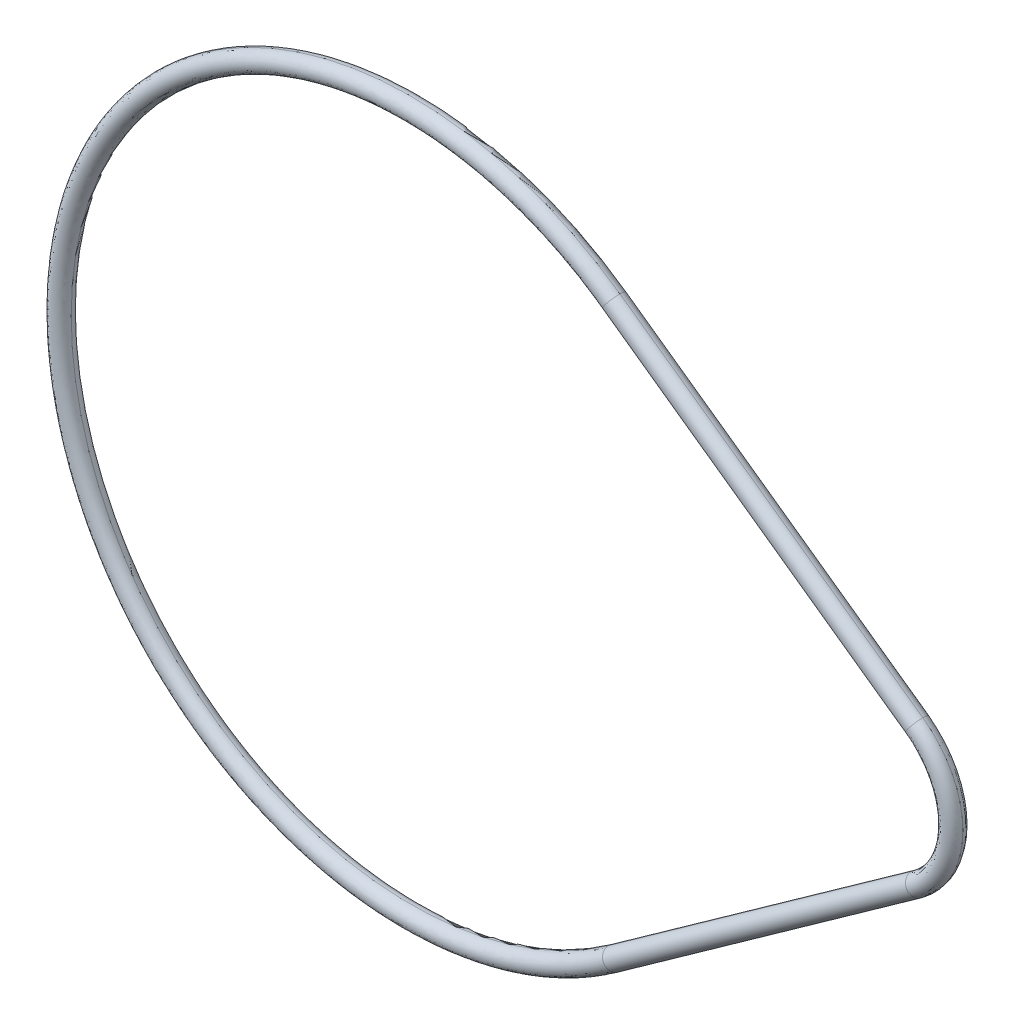
ISO-10303-21;
HEADER;
FILE_DESCRIPTION(('STEP AP214'),'2;1');
FILE_NAME('part.step','',(''),(''),'','','');
FILE_SCHEMA(('AUTOMOTIVE_DESIGN { 1 0 10303 214 1 1 1 1 }'));
ENDSEC;
DATA;
#1=APPLICATION_CONTEXT('core data for automotive mechanical design processes');
#2=APPLICATION_PROTOCOL_DEFINITION('international standard','automotive_design',2000,#1);
#3=PRODUCT_CONTEXT('',#1,'mechanical');
#4=PRODUCT('Part','Part','',(#3));
#5=PRODUCT_RELATED_PRODUCT_CATEGORY('part','',(#4));
#6=PRODUCT_DEFINITION_FORMATION('','',#4);
#7=PRODUCT_DEFINITION_CONTEXT('part definition',#1,'design');
#8=PRODUCT_DEFINITION('design','',#6,#7);
#9=PRODUCT_DEFINITION_SHAPE('','',#8);
#10=(LENGTH_UNIT() NAMED_UNIT(*) SI_UNIT(.MILLI.,.METRE.));
#11=(NAMED_UNIT(*) PLANE_ANGLE_UNIT() SI_UNIT($,.RADIAN.));
#12=(NAMED_UNIT(*) SI_UNIT($,.STERADIAN.) SOLID_ANGLE_UNIT());
#13=UNCERTAINTY_MEASURE_WITH_UNIT(LENGTH_MEASURE(1.E-05),#10,'distance_accuracy_value','');
#14=(GEOMETRIC_REPRESENTATION_CONTEXT(3) GLOBAL_UNCERTAINTY_ASSIGNED_CONTEXT((#13)) GLOBAL_UNIT_ASSIGNED_CONTEXT((#10,
#11,#12)) REPRESENTATION_CONTEXT('',''));
#15=CARTESIAN_POINT('',(0.,0.,0.));
#16=DIRECTION('',(0.,0.,1.));
#17=DIRECTION('',(1.,0.,0.));
#18=AXIS2_PLACEMENT_3D('',#15,#16,#17);
#19=CARTESIAN_POINT('',(20.8161999194433,-29.2365851450577,-0.000527050012894062));
#20=CARTESIAN_POINT('',(-5.33979762134282,-47.8594328955761,-0.000527050012904014));
#21=CARTESIAN_POINT('',(-26.7480982643424,-23.9297164477879,-0.000527050012908594));
#22=CARTESIAN_POINT('',(-48.156398907342,0.,-0.000527050012913173));
#23=CARTESIAN_POINT('',(-26.748098264342,23.9297164477884,-0.000527050012904236));
#24=CARTESIAN_POINT('',(-5.339797621342,47.8594328955762,-0.000527050012895298));
#25=CARTESIAN_POINT('',(20.816199919444,29.2365851450574,-0.000527050012888737));
#26=CARTESIAN_POINT('',(20.8162,-29.2365852582005,-0.00026352502464842));
#27=CARTESIAN_POINT('',(-5.33979764200732,-47.8594330807876,-0.000263525024658373));
#28=CARTESIAN_POINT('',(-26.748098367855,-23.9297165403936,-0.000263525024662952));
#29=CARTESIAN_POINT('',(-48.1563990937028,0.,-0.000263525024667531));
#30=CARTESIAN_POINT('',(-26.7480983678546,23.9297165403941,-0.000263525024658594));
#31=CARTESIAN_POINT('',(-5.33979764200651,47.8594330807877,-0.000263525024649656));
#32=CARTESIAN_POINT('',(20.8162000000007,29.2365852582002,-0.000263525024643095));
#33=CARTESIAN_POINT('',(20.8162,-29.2365852582005,1.98441115552759E-13));
#34=CARTESIAN_POINT('',(-5.33979764200732,-47.8594330807876,1.88488159173581E-13));
#35=CARTESIAN_POINT('',(-26.748098367855,-23.9297165403936,1.8390899366285E-13));
#36=CARTESIAN_POINT('',(-48.1563990937027,0.,1.79329828152119E-13));
#37=CARTESIAN_POINT('',(-26.7480983678546,23.9297165403941,1.8826726768798E-13));
#38=CARTESIAN_POINT('',(-5.33979764200651,47.8594330807877,1.9720470722384E-13));
#39=CARTESIAN_POINT('',(20.8162000000007,29.2365852582002,2.03765919542777E-13));
#40=CARTESIAN_POINT('',(20.8162000000002,-29.2365852582005,1.00000000000019));
#41=CARTESIAN_POINT('',(-5.33979764200732,-47.8594330807876,1.00000000000018));
#42=CARTESIAN_POINT('',(-26.748098367855,-23.9297165403936,1.00000000000017));
#43=CARTESIAN_POINT('',(-48.1563990937027,0.,1.00000000000017));
#44=CARTESIAN_POINT('',(-26.7480983678546,23.9297165403941,1.00000000000018));
#45=CARTESIAN_POINT('',(-5.33979764200651,47.8594330807878,1.00000000000018));
#46=CARTESIAN_POINT('',(20.8162000000007,29.2365852582002,1.00000000000019));
#47=CARTESIAN_POINT('',(20.2362,-28.4219687840239,1.00000000000019));
#48=CARTESIAN_POINT('',(-5.19101531706981,-46.5259297907128,1.00000000000018));
#49=CARTESIAN_POINT('',(-26.002818391041,-23.2629648953562,1.00000000000017));
#50=CARTESIAN_POINT('',(-46.8146214650122,0.,1.00000000000017));
#51=CARTESIAN_POINT('',(-26.0028183910406,23.2629648953566,1.00000000000018));
#52=CARTESIAN_POINT('',(-5.19101531706902,46.5259297907128,1.00000000000018));
#53=CARTESIAN_POINT('',(20.2362000000007,28.4219687840236,1.00000000000019));
#54=CARTESIAN_POINT('',(19.6562000000002,-27.6073523098472,1.00000000000019));
#55=CARTESIAN_POINT('',(-5.0422329921323,-45.1924265006379,1.00000000000018));
#56=CARTESIAN_POINT('',(-25.257538414227,-22.5962132503188,1.00000000000017));
#57=CARTESIAN_POINT('',(-45.4728438363218,0.,1.00000000000017));
#58=CARTESIAN_POINT('',(-25.2575384142266,22.5962132503192,1.00000000000018));
#59=CARTESIAN_POINT('',(-5.04223299213154,45.192426500638,1.00000000000018));
#60=CARTESIAN_POINT('',(19.6562000000007,27.6073523098469,1.00000000000019));
#61=CARTESIAN_POINT('',(19.6562,-27.6073523098472,1.98100819578805E-13));
#62=CARTESIAN_POINT('',(-5.0422329921323,-45.1924265006379,1.8870249994408E-13));
#63=CARTESIAN_POINT('',(-25.257538414227,-22.5962132503188,1.84378512227203E-13));
#64=CARTESIAN_POINT('',(-45.4728438363218,0.,1.80054524510327E-13));
#65=CARTESIAN_POINT('',(-25.2575384142266,22.5962132503192,1.88493917819614E-13));
#66=CARTESIAN_POINT('',(-5.04223299213154,45.192426500638,1.96933311128902E-13));
#67=CARTESIAN_POINT('',(19.6562000000007,27.6073523098469,2.03128894452634E-13));
#68=(BOUNDED_SURFACE() B_SPLINE_SURFACE(2,2,((#19,#20,#21,#22,#23,#24,#25),(#26,#27,#28,#29,#30,
#31,#32),(#33,#34,#35,#36,#37,#38,#39),(#40,#41,#42,#43,#44,#45,#46),(#47,#48,#49,#50,#51,#52,
#53),(#54,#55,#56,#57,#58,#59,#60),(#61,#62,#63,#64,#65,#66,#67)),.UNSPECIFIED.,.F.,.F.,
.F.) B_SPLINE_SURFACE_WITH_KNOTS((3,2,2,3),(3,2,2,3),(-0.000585341525006589,0.,1.5707963267949,
3.14159265358979),(-2.18952501746714,-0.729841672489042,0.729841672489059,2.18952501746716),
.UNSPECIFIED.) GEOMETRIC_REPRESENTATION_ITEM() RATIONAL_B_SPLINE_SURFACE(((0.999781793891307,
0.745117352170373,0.999781793891307,0.745117352170373,0.999781793891307,0.745117352170373,
0.999781793891307),(0.999890856274337,0.745198634180668,0.999890856274337,0.745198634180668,
0.999890856274337,0.745198634180668,0.999890856274337),(1.,0.745279976814,1.,0.745279976814,1.,
0.745279976814,1.),(0.707106781186543,0.526992525487729,0.707106781186543,0.526992525487729,
0.707106781186543,0.526992525487729,0.707106781186543),(1.,0.745279976814,1.,0.745279976814,1.,
0.745279976814,1.),(0.707106781186543,0.526992525487729,0.707106781186543,0.526992525487729,
0.707106781186543,0.526992525487729,0.707106781186543),(1.,0.745279976814,1.,0.745279976814,1.,
0.745279976814,1.))) REPRESENTATION_ITEM('') SURFACE());
#69=CARTESIAN_POINT('',(1.10996281610376E-09,9.92967860713456E-10,-3.3298462113317E-10));
#70=DIRECTION('',(-6.91837340867679E-12,-6.18959265071732E-12,-1.));
#71=DIRECTION('',(0.579999999966181,-0.814616474200731,1.02948756506753E-12));
#72=AXIS2_PLACEMENT_3D('',#69,#70,#71);
#73=CIRCLE('',#72,35.8900000014617);
#74=CARTESIAN_POINT('',(20.8162000007653,-29.2365852592919,-2.96036312421354E-10));
#75=VERTEX_POINT('',#74);
#76=CARTESIAN_POINT('',(20.8161999999804,29.2365852581906,-3.20402871304821E-10));
#77=VERTEX_POINT('',#76);
#78=EDGE_CURVE('E99',#75,#77,#73,.T.);
#79=CARTESIAN_POINT('',(20.2361999981067,-28.4219687814218,-3.19397772695076E-09));
#80=DIRECTION('',(-0.814616474162998,-0.580000000019177,2.34705305098352E-11));
#81=DIRECTION('',(0.580000000019178,-0.814616474162998,2.89794140134146E-09));
#82=AXIS2_PLACEMENT_3D('',#79,#80,#81);
#83=CIRCLE('',#82,1.000000004542);
#84=CARTESIAN_POINT('',(20.2362,-28.421968784,1.));
#85=VERTEX_POINT('',#84);
#86=EDGE_CURVE('E148',#75,#85,#83,.T.);
#87=CARTESIAN_POINT('',(20.2361999999972,-28.4219687839964,2.40562885060415E-11));
#88=DIRECTION('',(-0.814616474168717,-0.580000000011145,1.50855292402276E-13));
#89=DIRECTION('',(2.7790270085817E-12,-3.64291929963893E-12,1.));
#90=AXIS2_PLACEMENT_3D('',#87,#88,#89);
#91=CIRCLE('',#90,0.999999999976658);
#92=CARTESIAN_POINT('',(19.6562,-27.6073523098472,1.98345748938635E-13));
#93=VERTEX_POINT('',#92);
#94=EDGE_CURVE('E151',#85,#93,#91,.T.);
#95=CARTESIAN_POINT('',(-2.0122792321331E-13,-2.16840434497101E-13,1.9468514359833E-13));
#96=DIRECTION('',(0.,0.,-1.));
#97=DIRECTION('',(0.580000000000001,-0.814616474176652,0.));
#98=AXIS2_PLACEMENT_3D('',#95,#96,#97);
#99=CIRCLE('',#98,33.8900000000003);
#100=CARTESIAN_POINT('',(19.6562000000007,27.6073523098469,2.03373823812464E-13));
#101=VERTEX_POINT('',#100);
#102=EDGE_CURVE('E82',#93,#101,#99,.T.);
#103=CARTESIAN_POINT('',(20.2362000000196,28.4219687840878,7.17318553670182E-11));
#104=DIRECTION('',(0.814616474170328,-0.580000000008882,-1.89070879529851E-11));
#105=DIRECTION('',(0.580000000008882,0.814616474170328,-3.92134726704346E-10));
#106=AXIS2_PLACEMENT_3D('',#103,#104,#105);
#107=CIRCLE('',#106,0.999999999917621);
#108=EDGE_CURVE('E139',#77,#101,#107,.T.);
#109=ORIENTED_EDGE('',*,*,#78,.F.);
#110=ORIENTED_EDGE('',*,*,#86,.T.);
#111=ORIENTED_EDGE('',*,*,#94,.T.);
#112=ORIENTED_EDGE('',*,*,#102,.T.);
#113=ORIENTED_EDGE('',*,*,#108,.F.);
#114=EDGE_LOOP('',(#109,#110,#111,#112,#113));
#115=FACE_BOUND('',#114,.T.);
#116=ADVANCED_FACE('F16',(#115),#68,.T.);
#117=CARTESIAN_POINT('',(51.0100000005733,-7.73885650542854,2.96036312419443E-10));
#118=CARTESIAN_POINT('',(51.0100000005863,-7.73885650541927,-1.00000000030818));
#119=CARTESIAN_POINT('',(50.4300000002273,-6.92424003075651,-1.00000000030818));
#120=CARTESIAN_POINT('',(49.8499999998683,-6.10962355609375,-1.00000000030818));
#121=CARTESIAN_POINT('',(49.8499999998553,-6.10962355610301,2.96036312419443E-10));
#122=CARTESIAN_POINT('',(49.8499999998553,-6.10962355610301,0.000353605470908468));
#123=CARTESIAN_POINT('',(49.8500001448978,-6.10962375981677,0.000707210557353443));
#124=CARTESIAN_POINT('',(20.8162000007653,-29.2365852592919,-2.96036312421354E-10));
#125=CARTESIAN_POINT('',(20.8162000007783,-29.2365852592826,-1.00000000090026));
#126=CARTESIAN_POINT('',(20.2362000004193,-28.4219687846199,-1.00000000090026));
#127=CARTESIAN_POINT('',(19.6562000000603,-27.6073523099571,-1.00000000090026));
#128=CARTESIAN_POINT('',(19.6562000000472,-27.6073523099664,-2.96036312421354E-10));
#129=CARTESIAN_POINT('',(19.6562000000472,-27.6073523099664,0.000353604878835844));
#130=CARTESIAN_POINT('',(19.6562001450896,-27.6073525136801,0.000707209965280819));
#131=(BOUNDED_SURFACE() B_SPLINE_SURFACE(1,2,((#117,#118,#119,#120,#121,#122,#123),(#124,#125,
#126,#127,#128,#129,#130)),.UNSPECIFIED.,.F.,.F.,.F.) B_SPLINE_SURFACE_WITH_KNOTS((2,2),(3,2,2,
3),(-18.5325247764019,18.5325247762823),(-3.14159265358979,-1.5707963267949,0.,
0.000785398162922866),
.UNSPECIFIED.) GEOMETRIC_REPRESENTATION_ITEM() RATIONAL_B_SPLINE_SURFACE(((1.,0.707106781186548,
1.,0.707106781186548,1.,0.999853553390682,0.999707253227973),(1.,0.707106781186548,1.,
0.707106781186548,1.,0.999853553390682,0.999707253227973))) REPRESENTATION_ITEM('') SURFACE());
#132=DIRECTION('',(-0.814616474176641,-0.580000000000016,0.));
#133=VECTOR('',#132,1.);
#134=CARTESIAN_POINT('',(34.7531,-16.8584879330858,0.));
#135=LINE('',#134,#133);
#136=CARTESIAN_POINT('',(49.85,-6.10962355632446,0.));
#137=VERTEX_POINT('',#136);
#138=EDGE_CURVE('E153',#137,#93,#135,.T.);
#139=CARTESIAN_POINT('',(50.4299999984992,-6.9242400300952,-1.70008332498611E-09));
#140=DIRECTION('',(0.814616474581305,0.579999999431661,6.97821768377562E-10));
#141=DIRECTION('',(1.50084112060326E-09,-9.0480314367039E-10,-1.));
#142=AXIS2_PLACEMENT_3D('',#139,#140,#141);
#143=CIRCLE('',#142,0.999999998303194);
#144=CARTESIAN_POINT('',(50.43,-6.924240031,-1.));
#145=VERTEX_POINT('',#144);
#146=EDGE_CURVE('E27',#145,#137,#143,.T.);
#147=CARTESIAN_POINT('',(50.4299999987685,-6.92424002858438,1.77876904545515E-09));
#148=DIRECTION('',(0.814616474221296,0.579999999937297,-7.71087917067685E-11));
#149=DIRECTION('',(0.579999999937297,-0.814616474221296,-1.48273272826167E-09));
#150=AXIS2_PLACEMENT_3D('',#147,#148,#149);
#151=CIRCLE('',#150,1.00000000321353);
#152=CARTESIAN_POINT('',(51.0100000005733,-7.73885650542854,2.96036312419443E-10));
#153=VERTEX_POINT('',#152);
#154=EDGE_CURVE('E65',#153,#145,#151,.T.);
#155=DIRECTION('',(-0.814616474170556,-0.580000000008562,-1.59738792104268E-11));
#156=VECTOR('',#155,1.);
#157=CARTESIAN_POINT('',(35.9131000006693,-18.4877208823602,0.));
#158=LINE('',#157,#156);
#159=EDGE_CURVE('E145',#153,#75,#158,.T.);
#160=CARTESIAN_POINT('',(20.2362,-28.4219687840238,2.40038336987855E-11));
#161=DIRECTION('',(-0.814616474176638,-0.58000000000002,-1.16463130915027E-13));
#162=DIRECTION('',(-0.58000000000002,0.814616474176637,-2.38054879498471E-11));
#163=AXIS2_PLACEMENT_3D('',#160,#161,#162);
#164=CIRCLE('',#163,0.999999999999996);
#165=EDGE_CURVE('E129',#93,#75,#164,.T.);
#166=ORIENTED_EDGE('',*,*,#138,.F.);
#167=ORIENTED_EDGE('',*,*,#146,.F.);
#168=ORIENTED_EDGE('',*,*,#154,.F.);
#169=ORIENTED_EDGE('',*,*,#159,.T.);
#170=ORIENTED_EDGE('',*,*,#165,.F.);
#171=EDGE_LOOP('',(#166,#167,#168,#169,#170));
#172=FACE_BOUND('',#171,.T.);
#173=ADVANCED_FACE('F241',(#172),#131,.T.);
#174=CARTESIAN_POINT('',(51.0099998854202,7.73885634374881,-0.000628572010337216));
#175=CARTESIAN_POINT('',(54.999999802448,4.89801034414475,-0.000628572010337029));
#176=CARTESIAN_POINT('',(54.999999802448,0.,-0.000628572010337148));
#177=CARTESIAN_POINT('',(54.9999998024479,-4.89801034414505,-0.000628572010337266));
#178=CARTESIAN_POINT('',(51.0099998854202,-7.73885634374916,-0.00062857201033759));
#179=CARTESIAN_POINT('',(51.0099999999999,7.73885650467743,-0.000314286036261268));
#180=CARTESIAN_POINT('',(54.9999999999994,4.89801044599831,-0.000314286036261081));
#181=CARTESIAN_POINT('',(54.9999999999994,0.,-0.0003142860362612));
#182=CARTESIAN_POINT('',(54.9999999999993,-4.89801044599861,-0.000314286036261318));
#183=CARTESIAN_POINT('',(51.0099999999999,-7.73885650467778,-0.000314286036261642));
#184=CARTESIAN_POINT('',(51.01,7.73885650467744,0.));
#185=CARTESIAN_POINT('',(54.9999999999994,4.89801044599831,0.));
#186=CARTESIAN_POINT('',(54.9999999999994,0.,0.));
#187=CARTESIAN_POINT('',(54.9999999999993,-4.89801044599861,0.));
#188=CARTESIAN_POINT('',(51.01,-7.73885650467779,0.));
#189=CARTESIAN_POINT('',(51.01,7.73885650467744,0.999999999999904));
#190=CARTESIAN_POINT('',(54.9999999999994,4.89801044599831,0.999999999999903));
#191=CARTESIAN_POINT('',(54.9999999999994,0.,0.999999999999904));
#192=CARTESIAN_POINT('',(54.9999999999993,-4.89801044599861,0.999999999999903));
#193=CARTESIAN_POINT('',(51.0099999999995,-7.7388565046778,0.999999999999904));
#194=CARTESIAN_POINT('',(50.43,6.92424003050081,0.999999999999903));
#195=CARTESIAN_POINT('',(53.9999999999994,4.38243039905108,0.999999999999903));
#196=CARTESIAN_POINT('',(53.9999999999994,0.,0.999999999999903));
#197=CARTESIAN_POINT('',(53.9999999999993,-4.38243039905135,0.999999999999903));
#198=CARTESIAN_POINT('',(50.43,-6.92424003050112,0.999999999999903));
#199=CARTESIAN_POINT('',(49.8499999999999,6.10962355632418,0.999999999999904));
#200=CARTESIAN_POINT('',(52.9999999999994,3.86685035210386,0.999999999999903));
#201=CARTESIAN_POINT('',(52.9999999999994,0.,0.999999999999904));
#202=CARTESIAN_POINT('',(52.9999999999993,-3.86685035210409,0.999999999999903));
#203=CARTESIAN_POINT('',(49.8499999999995,-6.10962355632447,0.999999999999904));
#204=CARTESIAN_POINT('',(49.85,6.10962355632418,0.));
#205=CARTESIAN_POINT('',(52.9999999999995,3.86685035210386,0.));
#206=CARTESIAN_POINT('',(52.9999999999994,0.,0.));
#207=CARTESIAN_POINT('',(52.9999999999993,-3.86685035210409,0.));
#208=CARTESIAN_POINT('',(49.85,-6.10962355632446,0.));
#209=(BOUNDED_SURFACE() B_SPLINE_SURFACE(2,2,((#174,#175,#176,#177,#178),(#179,#180,#181,#182,
#183),(#184,#185,#186,#187,#188),(#189,#190,#191,#192,#193),(#194,#195,#196,#197,#198),(#199,
#200,#201,#202,#203),(#204,#205,#206,#207,#208)),.UNSPECIFIED.,.F.,.F.,
.F.) B_SPLINE_SURFACE_WITH_KNOTS((3,2,2,3),(3,2,3),(-0.000698077157127888,0.,1.5707963267949,
3.14159265358979),(2.18952501746719,3.1415926535898,4.09366028971246),
.UNSPECIFIED.) GEOMETRIC_REPRESENTATION_ITEM() RATIONAL_B_SPLINE_SURFACE(((0.999739786505589,
0.888588158918728,0.999739786505589,0.888588158918728,0.999739786505589),(0.999869835406384,
0.888703748910131,0.999869835406384,0.888703748910131,0.999869835406384),(1.,0.888819441731562,
1.,0.888819441731562,1.),(0.707106781186542,0.628490254498824,0.707106781186542,
0.628490254498824,0.707106781186542),(1.,0.888819441731562,1.,0.888819441731562,1.),
(0.707106781186541,0.628490254498823,0.707106781186541,0.628490254498823,0.707106781186541),(1.,
0.888819441731562,1.,0.888819441731562,1.))) REPRESENTATION_ITEM('') SURFACE());
#210=CARTESIAN_POINT('',(45.4999999991449,0.,1.34340740244013E-13));
#211=DIRECTION('',(0.,0.,-1.));
#212=DIRECTION('',(0.580000000043729,0.814616474145518,0.));
#213=AXIS2_PLACEMENT_3D('',#210,#211,#212);
#214=CIRCLE('',#213,9.50000000080368);
#215=CARTESIAN_POINT('',(51.01,7.738856505,0.));
#216=VERTEX_POINT('',#215);
#217=EDGE_CURVE('E106',#216,#153,#214,.T.);
#218=CARTESIAN_POINT('',(50.4299999997107,6.92424003009456,4.98879198338669E-10));
#219=DIRECTION('',(-0.814616474176667,0.579999999999979,0.));
#220=DIRECTION('',(-0.579999999999978,-0.814616474176668,-4.98976862135352E-10));
#221=AXIS2_PLACEMENT_3D('',#218,#219,#220);
#222=CIRCLE('',#221,0.99999999951553);
#223=CARTESIAN_POINT('',(49.85,6.10962355632418,0.));
#224=VERTEX_POINT('',#223);
#225=EDGE_CURVE('E110',#224,#216,#222,.T.);
#226=CARTESIAN_POINT('',(45.5000000000002,1.09145346476157E-13,0.));
#227=DIRECTION('',(0.,0.,-1.));
#228=DIRECTION('',(0.580000000000031,0.81461647417663,0.));
#229=AXIS2_PLACEMENT_3D('',#226,#227,#228);
#230=CIRCLE('',#229,7.49999999999918);
#231=EDGE_CURVE('E11',#224,#137,#230,.T.);
#232=CARTESIAN_POINT('',(50.4300000000006,-6.92424003050199,-4.99046528938033E-10));
#233=DIRECTION('',(0.814616474176684,0.579999999999955,3.3660565295496E-13));
#234=DIRECTION('',(-0.579999999999955,0.814616474176684,4.98948570116978E-10));
#235=AXIS2_PLACEMENT_3D('',#232,#233,#234);
#236=CIRCLE('',#235,1.00000000000103);
#237=EDGE_CURVE('E20',#137,#153,#236,.T.);
#238=ORIENTED_EDGE('',*,*,#217,.F.);
#239=ORIENTED_EDGE('',*,*,#225,.F.);
#240=ORIENTED_EDGE('',*,*,#231,.T.);
#241=ORIENTED_EDGE('',*,*,#237,.T.);
#242=EDGE_LOOP('',(#238,#239,#240,#241));
#243=FACE_BOUND('',#242,.T.);
#244=ADVANCED_FACE('F108',(#243),#209,.T.);
#245=CARTESIAN_POINT('',(20.8161999999804,29.2365852581906,-3.20402871304821E-10));
#246=CARTESIAN_POINT('',(20.8161999999945,29.2365852581806,-1.00000000024847));
#247=CARTESIAN_POINT('',(20.2362000000277,28.4219687840686,-1.00000000024847));
#248=CARTESIAN_POINT('',(19.6562000000608,27.6073523099567,-1.00000000024847));
#249=CARTESIAN_POINT('',(19.6562000000468,27.6073523099667,-3.20402871304821E-10));
#250=CARTESIAN_POINT('',(19.6562000000468,27.6073523099667,0.000353604854469317));
#251=CARTESIAN_POINT('',(19.6562001450892,27.6073525136805,0.000707209940914325));
#252=CARTESIAN_POINT('',(51.009999999789,7.73885650432694,3.20402871302742E-10));
#253=CARTESIAN_POINT('',(51.0099999998031,7.73885650431691,-0.999999999607669));
#254=CARTESIAN_POINT('',(50.4299999998362,6.92424003020495,-0.999999999607668));
#255=CARTESIAN_POINT('',(49.8499999998694,6.10962355609299,-0.999999999607669));
#256=CARTESIAN_POINT('',(49.8499999998553,6.10962355610301,3.20402871302742E-10));
#257=CARTESIAN_POINT('',(49.8499999998553,6.10962355610302,0.000353605495275059));
#258=CARTESIAN_POINT('',(49.8500001448977,6.10962375981677,0.000707210581720066));
#259=(BOUNDED_SURFACE() B_SPLINE_SURFACE(1,2,((#245,#246,#247,#248,#249,#250,#251),(#252,#253,
#254,#255,#256,#257,#258)),.UNSPECIFIED.,.F.,.F.,.F.) B_SPLINE_SURFACE_WITH_KNOTS((2,2),(3,2,2,
3),(-18.5325247888129,18.5325247889331),(-3.14159265358979,-1.5707963267949,0.,
0.000785398163453904),
.UNSPECIFIED.) GEOMETRIC_REPRESENTATION_ITEM() RATIONAL_B_SPLINE_SURFACE(((1.,0.707106781186548,
1.,0.707106781186548,1.,0.999853553390583,0.999707253227775),(1.,0.707106781186548,1.,
0.707106781186548,1.,0.999853553390583,0.999707253227775))) REPRESENTATION_ITEM('') SURFACE());
#260=DIRECTION('',(0.814616474176635,-0.580000000000024,0.));
#261=VECTOR('',#260,1.);
#262=CARTESIAN_POINT('',(34.7531000000004,16.8584879330855,0.));
#263=LINE('',#262,#261);
#264=EDGE_CURVE('E131',#101,#224,#263,.T.);
#265=CARTESIAN_POINT('',(20.236200000024,28.4219687840337,2.17529756757563E-11));
#266=DIRECTION('',(0.81461647416905,-0.580000000010678,0.));
#267=DIRECTION('',(-0.580000000010678,-0.81461647416905,-2.15496018514738E-11));
#268=AXIS2_PLACEMENT_3D('',#265,#266,#267);
#269=CIRCLE('',#268,1.00000000002116);
#270=CARTESIAN_POINT('',(20.2362,28.421968784,-1.));
#271=VERTEX_POINT('',#270);
#272=EDGE_CURVE('E175',#101,#271,#269,.T.);
#273=CARTESIAN_POINT('',(20.2362000000152,28.4219687840401,-4.15315329009358E-11));
#274=DIRECTION('',(0.814616474184309,-0.579999999989245,1.08558209864919E-11));
#275=DIRECTION('',(-1.52378110136131E-11,-4.01206845540579E-11,-1.));
#276=AXIS2_PLACEMENT_3D('',#273,#274,#275);
#277=CIRCLE('',#276,0.999999999959658);
#278=EDGE_CURVE('E91',#271,#77,#277,.T.);
#279=DIRECTION('',(0.814616474181052,-0.57999999999382,8.64433947829188E-12));
#280=VECTOR('',#279,1.);
#281=CARTESIAN_POINT('',(35.9130999999902,18.4877208815953,-1.6020143565241E-10));
#282=LINE('',#281,#280);
#283=EDGE_CURVE('E124',#77,#216,#282,.T.);
#284=CARTESIAN_POINT('',(50.4299999995584,6.92424003020307,7.61595903270509E-10));
#285=DIRECTION('',(-0.814616474176654,0.579999999999997,-1.87092293804714E-10));
#286=DIRECTION('',(0.579999999999996,0.814616474176655,-7.615959026906E-10));
#287=AXIS2_PLACEMENT_3D('',#284,#285,#286);
#288=CIRCLE('',#287,1.00000000073966);
#289=EDGE_CURVE('E116',#216,#224,#288,.T.);
#290=ORIENTED_EDGE('',*,*,#264,.F.);
#291=ORIENTED_EDGE('',*,*,#272,.T.);
#292=ORIENTED_EDGE('',*,*,#278,.T.);
#293=ORIENTED_EDGE('',*,*,#283,.T.);
#294=ORIENTED_EDGE('',*,*,#289,.T.);
#295=EDGE_LOOP('',(#290,#291,#292,#293,#294));
#296=FACE_BOUND('',#295,.T.);
#297=ADVANCED_FACE('F125',(#296),#259,.T.);
#298=CARTESIAN_POINT('',(49.85,6.10962355632418,0.));
#299=CARTESIAN_POINT('',(52.9999999999995,3.86685035210386,0.));
#300=CARTESIAN_POINT('',(52.9999999999994,0.,0.));
#301=CARTESIAN_POINT('',(52.9999999999993,-3.86685035210409,0.));
#302=CARTESIAN_POINT('',(49.85,-6.10962355632446,0.));
#303=CARTESIAN_POINT('',(49.8499999999999,6.10962355632418,-1.0000000000001));
#304=CARTESIAN_POINT('',(52.9999999999994,3.86685035210386,-1.0000000000001));
#305=CARTESIAN_POINT('',(52.9999999999994,0.,-1.0000000000001));
#306=CARTESIAN_POINT('',(52.9999999999993,-3.86685035210409,-1.0000000000001));
#307=CARTESIAN_POINT('',(49.8499999999995,-6.10962355632446,-1.0000000000001));
#308=CARTESIAN_POINT('',(50.43,6.92424003050081,-1.0000000000001));
#309=CARTESIAN_POINT('',(53.9999999999994,4.38243039905108,-1.0000000000001));
#310=CARTESIAN_POINT('',(53.9999999999994,0.,-1.0000000000001));
#311=CARTESIAN_POINT('',(53.9999999999993,-4.38243039905135,-1.0000000000001));
#312=CARTESIAN_POINT('',(50.43,-6.92424003050112,-1.0000000000001));
#313=CARTESIAN_POINT('',(51.01,7.73885650467744,-1.0000000000001));
#314=CARTESIAN_POINT('',(54.9999999999994,4.89801044599831,-1.0000000000001));
#315=CARTESIAN_POINT('',(54.9999999999994,0.,-1.0000000000001));
#316=CARTESIAN_POINT('',(54.9999999999993,-4.89801044599861,-1.0000000000001));
#317=CARTESIAN_POINT('',(51.0099999999995,-7.7388565046778,-1.0000000000001));
#318=CARTESIAN_POINT('',(51.01,7.73885650467744,0.));
#319=CARTESIAN_POINT('',(54.9999999999994,4.89801044599831,0.));
#320=CARTESIAN_POINT('',(54.9999999999994,0.,0.));
#321=CARTESIAN_POINT('',(54.9999999999993,-4.89801044599861,0.));
#322=CARTESIAN_POINT('',(51.01,-7.73885650467779,0.));
#323=CARTESIAN_POINT('',(51.0099999999999,7.73885650467743,0.000314286036065904));
#324=CARTESIAN_POINT('',(54.9999999999994,4.89801044599831,0.000314286036066091));
#325=CARTESIAN_POINT('',(54.9999999999994,0.,0.000314286036065973));
#326=CARTESIAN_POINT('',(54.9999999999993,-4.89801044599861,0.000314286036065854));
#327=CARTESIAN_POINT('',(51.0099999999999,-7.73885650467778,0.00031428603606553));
#328=CARTESIAN_POINT('',(51.0099998854202,7.73885634374881,0.000628572010141832));
#329=CARTESIAN_POINT('',(54.999999802448,4.89801034414475,0.000628572010142019));
#330=CARTESIAN_POINT('',(54.999999802448,0.,0.000628572010141901));
#331=CARTESIAN_POINT('',(54.9999998024479,-4.89801034414505,0.000628572010141782));
#332=CARTESIAN_POINT('',(51.0099998854202,-7.73885634374916,0.000628572010141458));
#333=(BOUNDED_SURFACE() B_SPLINE_SURFACE(2,2,((#298,#299,#300,#301,#302),(#303,#304,#305,#306,
#307),(#308,#309,#310,#311,#312),(#313,#314,#315,#316,#317),(#318,#319,#320,#321,#322),(#323,
#324,#325,#326,#327),(#328,#329,#330,#331,#332)),.UNSPECIFIED.,.F.,.F.,
.F.) B_SPLINE_SURFACE_WITH_KNOTS((3,2,2,3),(3,2,3),(-3.14159265358979,-1.5707963267949,0.,
0.000698077157127888),(2.18952501746719,3.1415926535898,4.09366028971246),
.UNSPECIFIED.) GEOMETRIC_REPRESENTATION_ITEM() RATIONAL_B_SPLINE_SURFACE(((1.,0.888819441731562,
1.,0.888819441731562,1.),(0.707106781186542,0.628490254498824,0.707106781186542,
0.628490254498824,0.707106781186542),(1.,0.888819441731562,1.,0.888819441731562,1.),
(0.707106781186542,0.628490254498824,0.707106781186542,0.628490254498824,0.707106781186542),(1.,
0.888819441731562,1.,0.888819441731562,1.),(0.999869835406384,0.888703748910131,
0.999869835406384,0.888703748910131,0.999869835406384),(0.999739786505589,0.888588158918728,
0.999739786505589,0.888588158918728,0.999739786505589))) REPRESENTATION_ITEM('') SURFACE());
#334=ORIENTED_EDGE('',*,*,#289,.F.);
#335=ORIENTED_EDGE('',*,*,#217,.T.);
#336=ORIENTED_EDGE('',*,*,#154,.T.);
#337=ORIENTED_EDGE('',*,*,#146,.T.);
#338=ORIENTED_EDGE('',*,*,#231,.F.);
#339=EDGE_LOOP('',(#334,#335,#336,#337,#338));
#340=FACE_BOUND('',#339,.T.);
#341=ADVANCED_FACE('F119',(#340),#333,.T.);
#342=CARTESIAN_POINT('',(-2.0122792321331E-13,-2.18575157973078E-13,3.33204382569519E-13));
#343=DIRECTION('',(0.,0.,-1.));
#344=DIRECTION('',(-1.,0.,0.));
#345=AXIS2_PLACEMENT_3D('',#342,#343,#344);
#346=TOROIDAL_SURFACE('',#345,34.8900000000003,1.00000000000008);
#347=ORIENTED_EDGE('',*,*,#165,.T.);
#348=ORIENTED_EDGE('',*,*,#78,.T.);
#349=ORIENTED_EDGE('',*,*,#278,.F.);
#350=ORIENTED_EDGE('',*,*,#272,.F.);
#351=ORIENTED_EDGE('',*,*,#102,.F.);
#352=EDGE_LOOP('',(#347,#348,#349,#350,#351));
#353=FACE_BOUND('',#352,.T.);
#354=ADVANCED_FACE('F222',(#353),#346,.T.);
#355=CARTESIAN_POINT('',(20.2361998218603,28.4219685463947,-4.01416895940944E-10));
#356=DIRECTION('',(0.814616474170556,-0.580000000008562,1.72886788797533E-11));
#357=DIRECTION('',(0.580000000008562,0.814616474170556,0.));
#358=AXIS2_PLACEMENT_3D('',#355,#356,#357);
#359=CYLINDRICAL_SURFACE('',#358,0.999999702977834);
#360=ORIENTED_EDGE('',*,*,#108,.T.);
#361=ORIENTED_EDGE('',*,*,#264,.T.);
#362=ORIENTED_EDGE('',*,*,#225,.T.);
#363=ORIENTED_EDGE('',*,*,#283,.F.);
#364=EDGE_LOOP('',(#360,#361,#362,#363));
#365=FACE_BOUND('',#364,.T.);
#366=ADVANCED_FACE('F18',(#365),#359,.T.);
#367=CARTESIAN_POINT('',(49.8500001448978,-6.10962375981676,-0.000707209965280795));
#368=CARTESIAN_POINT('',(49.8499999998553,-6.109623556103,-0.000353604878835832));
#369=CARTESIAN_POINT('',(49.8499999998553,-6.10962355610301,2.96036312419443E-10));
#370=CARTESIAN_POINT('',(49.8499999998423,-6.10962355611228,1.00000000090025));
#371=CARTESIAN_POINT('',(50.4300000002013,-6.92424003077504,1.00000000090025));
#372=CARTESIAN_POINT('',(51.0100000005603,-7.7388565054378,1.00000000090025));
#373=CARTESIAN_POINT('',(51.0100000005733,-7.73885650542854,2.96036312419443E-10));
#374=CARTESIAN_POINT('',(19.6562001450897,-27.6073525136801,-0.000707210557353426));
#375=CARTESIAN_POINT('',(19.6562000000472,-27.6073523099664,-0.000353605470908459));
#376=CARTESIAN_POINT('',(19.6562000000472,-27.6073523099664,-2.96036312421354E-10));
#377=CARTESIAN_POINT('',(19.6562000000342,-27.6073523099756,1.00000000030818));
#378=CARTESIAN_POINT('',(20.2362000003932,-28.4219687846384,1.00000000030818));
#379=CARTESIAN_POINT('',(20.8162000007522,-29.2365852593012,1.00000000030818));
#380=CARTESIAN_POINT('',(20.8162000007653,-29.2365852592919,-2.96036312421354E-10));
#381=(BOUNDED_SURFACE() B_SPLINE_SURFACE(1,2,((#367,#368,#369,#370,#371,#372,#373),(#374,#375,
#376,#377,#378,#379,#380)),.UNSPECIFIED.,.F.,.F.,.F.) B_SPLINE_SURFACE_WITH_KNOTS((2,2),(3,2,2,
3),(-18.5325247764019,18.5325247762823),(-0.000785398162922866,0.,1.5707963267949,
3.14159265358979),
.UNSPECIFIED.) GEOMETRIC_REPRESENTATION_ITEM() RATIONAL_B_SPLINE_SURFACE(((0.999707253227973,
0.999853553390682,1.,0.707106781186548,1.,0.707106781186548,1.),(0.999707253227973,
0.999853553390682,1.,0.707106781186548,1.,0.707106781186548,1.))) REPRESENTATION_ITEM('') SURFACE());
#382=ORIENTED_EDGE('',*,*,#237,.F.);
#383=ORIENTED_EDGE('',*,*,#138,.T.);
#384=ORIENTED_EDGE('',*,*,#94,.F.);
#385=ORIENTED_EDGE('',*,*,#86,.F.);
#386=ORIENTED_EDGE('',*,*,#159,.F.);
#387=EDGE_LOOP('',(#382,#383,#384,#385,#386));
#388=FACE_BOUND('',#387,.T.);
#389=ADVANCED_FACE('F207',(#388),#381,.T.);
#390=CLOSED_SHELL('',(#116,#173,#244,#297,#341,#354,#366,#389));
#391=MANIFOLD_SOLID_BREP('B1',#390);
#392=ADVANCED_BREP_SHAPE_REPRESENTATION('',(#18,#391),#14);
#393=SHAPE_DEFINITION_REPRESENTATION(#9,#392);
ENDSEC;
END-ISO-10303-21;
